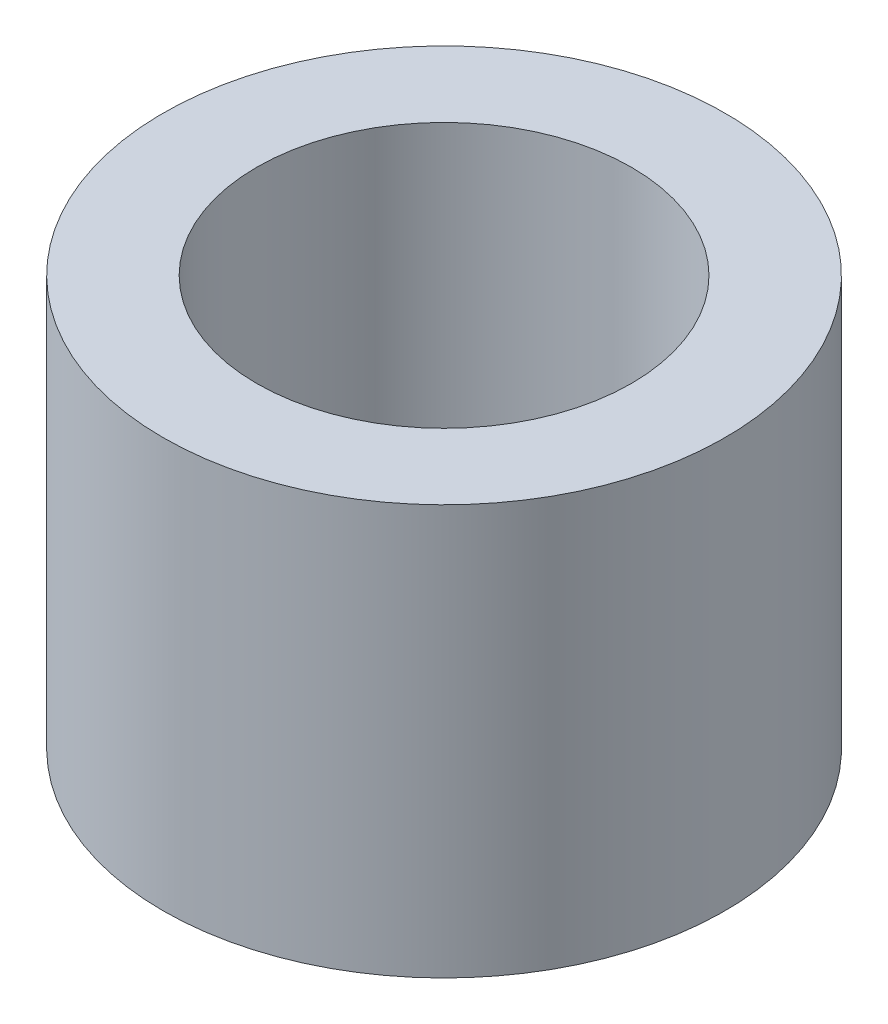
ISO-10303-21;
HEADER;
FILE_DESCRIPTION(('STEP AP214'),'2;1');
FILE_NAME('part.step','',(''),(''),'','','');
FILE_SCHEMA(('AUTOMOTIVE_DESIGN { 1 0 10303 214 1 1 1 1 }'));
ENDSEC;
DATA;
#1=APPLICATION_CONTEXT('core data for automotive mechanical design processes');
#2=APPLICATION_PROTOCOL_DEFINITION('international standard','automotive_design',2000,#1);
#3=PRODUCT_CONTEXT('',#1,'mechanical');
#4=PRODUCT('Part','Part','',(#3));
#5=PRODUCT_RELATED_PRODUCT_CATEGORY('part','',(#4));
#6=PRODUCT_DEFINITION_FORMATION('','',#4);
#7=PRODUCT_DEFINITION_CONTEXT('part definition',#1,'design');
#8=PRODUCT_DEFINITION('design','',#6,#7);
#9=PRODUCT_DEFINITION_SHAPE('','',#8);
#10=(LENGTH_UNIT() NAMED_UNIT(*) SI_UNIT(.MILLI.,.METRE.));
#11=(NAMED_UNIT(*) PLANE_ANGLE_UNIT() SI_UNIT($,.RADIAN.));
#12=(NAMED_UNIT(*) SI_UNIT($,.STERADIAN.) SOLID_ANGLE_UNIT());
#13=UNCERTAINTY_MEASURE_WITH_UNIT(LENGTH_MEASURE(1.E-05),#10,'distance_accuracy_value','');
#14=(GEOMETRIC_REPRESENTATION_CONTEXT(3) GLOBAL_UNCERTAINTY_ASSIGNED_CONTEXT((#13)) GLOBAL_UNIT_ASSIGNED_CONTEXT((#10,
#11,#12)) REPRESENTATION_CONTEXT('',''));
#15=CARTESIAN_POINT('',(0.,0.,0.));
#16=DIRECTION('',(0.,0.,1.));
#17=DIRECTION('',(1.,0.,0.));
#18=AXIS2_PLACEMENT_3D('',#15,#16,#17);
#19=CARTESIAN_POINT('',(0.,3.5,0.));
#20=DIRECTION('',(0.,1.,0.));
#21=DIRECTION('',(0.,0.,1.));
#22=AXIS2_PLACEMENT_3D('',#19,#20,#21);
#23=PLANE('',#22);
#24=CARTESIAN_POINT('',(0.,3.5,0.));
#25=DIRECTION('',(0.,1.,0.));
#26=DIRECTION('',(0.,0.,1.));
#27=AXIS2_PLACEMENT_3D('',#24,#25,#26);
#28=CIRCLE('',#27,2.4);
#29=CARTESIAN_POINT('',(0.,3.5,2.4));
#30=VERTEX_POINT('',#29);
#31=EDGE_CURVE('E10',#30,#30,#28,.T.);
#32=ORIENTED_EDGE('',*,*,#31,.T.);
#33=EDGE_LOOP('',(#32));
#34=FACE_BOUND('',#33,.T.);
#35=CARTESIAN_POINT('',(0.,3.5,0.));
#36=DIRECTION('',(0.,1.,0.));
#37=DIRECTION('',(0.,0.,1.));
#38=AXIS2_PLACEMENT_3D('',#35,#36,#37);
#39=CIRCLE('',#38,1.6);
#40=CARTESIAN_POINT('',(0.,3.5,1.6));
#41=VERTEX_POINT('',#40);
#42=EDGE_CURVE('E60',#41,#41,#39,.T.);
#43=ORIENTED_EDGE('',*,*,#42,.F.);
#44=EDGE_LOOP('',(#43));
#45=FACE_BOUND('',#44,.T.);
#46=ADVANCED_FACE('F47',(#34,#45),#23,.T.);
#47=CARTESIAN_POINT('',(0.,0.,0.));
#48=DIRECTION('',(0.,1.,0.));
#49=DIRECTION('',(0.,0.,1.));
#50=AXIS2_PLACEMENT_3D('',#47,#48,#49);
#51=PLANE('',#50);
#52=CARTESIAN_POINT('',(0.,0.,0.));
#53=DIRECTION('',(0.,1.,0.));
#54=DIRECTION('',(0.,0.,1.));
#55=AXIS2_PLACEMENT_3D('',#52,#53,#54);
#56=CIRCLE('',#55,2.4);
#57=CARTESIAN_POINT('',(0.,0.,2.4));
#58=VERTEX_POINT('',#57);
#59=EDGE_CURVE('E51',#58,#58,#56,.T.);
#60=ORIENTED_EDGE('',*,*,#59,.F.);
#61=EDGE_LOOP('',(#60));
#62=FACE_BOUND('',#61,.T.);
#63=CARTESIAN_POINT('',(0.,0.,0.));
#64=DIRECTION('',(0.,1.,0.));
#65=DIRECTION('',(0.,0.,1.));
#66=AXIS2_PLACEMENT_3D('',#63,#64,#65);
#67=CIRCLE('',#66,1.6);
#68=CARTESIAN_POINT('',(0.,0.,1.6));
#69=VERTEX_POINT('',#68);
#70=EDGE_CURVE('E62',#69,#69,#67,.T.);
#71=ORIENTED_EDGE('',*,*,#70,.T.);
#72=EDGE_LOOP('',(#71));
#73=FACE_BOUND('',#72,.T.);
#74=ADVANCED_FACE('F74',(#62,#73),#51,.F.);
#75=CARTESIAN_POINT('',(0.,3.5,0.));
#76=DIRECTION('',(0.,-1.,0.));
#77=DIRECTION('',(0.,0.,-1.));
#78=AXIS2_PLACEMENT_3D('',#75,#76,#77);
#79=CYLINDRICAL_SURFACE('',#78,2.4);
#80=ORIENTED_EDGE('',*,*,#31,.F.);
#81=EDGE_LOOP('',(#80));
#82=FACE_BOUND('',#81,.T.);
#83=ORIENTED_EDGE('',*,*,#59,.T.);
#84=EDGE_LOOP('',(#83));
#85=FACE_BOUND('',#84,.T.);
#86=ADVANCED_FACE('F49',(#82,#85),#79,.T.);
#87=CARTESIAN_POINT('',(0.,3.5,0.));
#88=DIRECTION('',(0.,-1.,0.));
#89=DIRECTION('',(0.,0.,-1.));
#90=AXIS2_PLACEMENT_3D('',#87,#88,#89);
#91=CYLINDRICAL_SURFACE('',#90,1.6);
#92=ORIENTED_EDGE('',*,*,#42,.T.);
#93=EDGE_LOOP('',(#92));
#94=FACE_BOUND('',#93,.T.);
#95=ORIENTED_EDGE('',*,*,#70,.F.);
#96=EDGE_LOOP('',(#95));
#97=FACE_BOUND('',#96,.T.);
#98=ADVANCED_FACE('F70',(#94,#97),#91,.F.);
#99=CLOSED_SHELL('',(#46,#74,#86,#98));
#100=MANIFOLD_SOLID_BREP('B2',#99);
#101=ADVANCED_BREP_SHAPE_REPRESENTATION('',(#18,#100),#14);
#102=SHAPE_DEFINITION_REPRESENTATION(#9,#101);
ENDSEC;
END-ISO-10303-21;
